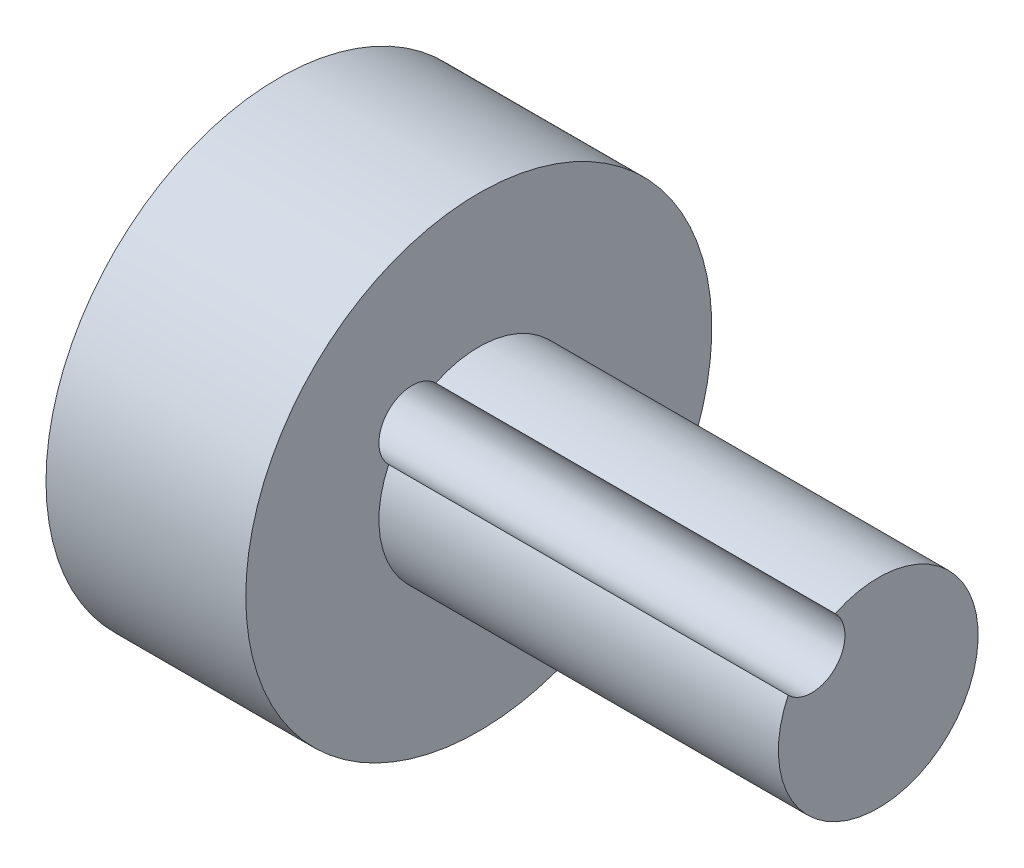
ISO-10303-21;
HEADER;
FILE_DESCRIPTION(('STEP AP214'),'2;1');
FILE_NAME('part.step','',(''),(''),'','','');
FILE_SCHEMA(('AUTOMOTIVE_DESIGN { 1 0 10303 214 1 1 1 1 }'));
ENDSEC;
DATA;
#1=APPLICATION_CONTEXT('core data for automotive mechanical design processes');
#2=APPLICATION_PROTOCOL_DEFINITION('international standard','automotive_design',2000,#1);
#3=PRODUCT_CONTEXT('',#1,'mechanical');
#4=PRODUCT('Part','Part','',(#3));
#5=PRODUCT_RELATED_PRODUCT_CATEGORY('part','',(#4));
#6=PRODUCT_DEFINITION_FORMATION('','',#4);
#7=PRODUCT_DEFINITION_CONTEXT('part definition',#1,'design');
#8=PRODUCT_DEFINITION('design','',#6,#7);
#9=PRODUCT_DEFINITION_SHAPE('','',#8);
#10=(LENGTH_UNIT() NAMED_UNIT(*) SI_UNIT(.MILLI.,.METRE.));
#11=(NAMED_UNIT(*) PLANE_ANGLE_UNIT() SI_UNIT($,.RADIAN.));
#12=(NAMED_UNIT(*) SI_UNIT($,.STERADIAN.) SOLID_ANGLE_UNIT());
#13=UNCERTAINTY_MEASURE_WITH_UNIT(LENGTH_MEASURE(1.E-05),#10,'distance_accuracy_value','');
#14=(GEOMETRIC_REPRESENTATION_CONTEXT(3) GLOBAL_UNCERTAINTY_ASSIGNED_CONTEXT((#13)) GLOBAL_UNIT_ASSIGNED_CONTEXT((#10,
#11,#12)) REPRESENTATION_CONTEXT('',''));
#15=CARTESIAN_POINT('',(0.,0.,0.));
#16=DIRECTION('',(0.,0.,1.));
#17=DIRECTION('',(1.,0.,0.));
#18=AXIS2_PLACEMENT_3D('',#15,#16,#17);
#19=CARTESIAN_POINT('',(0.,0.,0.));
#20=DIRECTION('',(-1.,0.,0.));
#21=DIRECTION('',(0.,0.,1.));
#22=AXIS2_PLACEMENT_3D('',#19,#20,#21);
#23=CYLINDRICAL_SURFACE('',#22,15.);
#24=DIRECTION('',(-1.,0.,0.));
#25=VECTOR('',#24,1.);
#26=CARTESIAN_POINT('',(50.,13.5355339059327,6.46446609406726));
#27=LINE('',#26,#25);
#28=CARTESIAN_POINT('',(100.,13.5355339059327,6.46446609406726));
#29=VERTEX_POINT('',#28);
#30=CARTESIAN_POINT('',(40.,13.5355339059327,6.46446609406726));
#31=VERTEX_POINT('',#30);
#32=EDGE_CURVE('E58',#29,#31,#27,.T.);
#33=ORIENTED_EDGE('',*,*,#32,.F.);
#34=CARTESIAN_POINT('',(100.,0.,0.));
#35=DIRECTION('',(-1.,0.,0.));
#36=DIRECTION('',(0.,0.,1.));
#37=AXIS2_PLACEMENT_3D('',#34,#35,#36);
#38=CIRCLE('',#37,15.);
#39=CARTESIAN_POINT('',(100.,6.46446609406726,13.5355339059327));
#40=VERTEX_POINT('',#39);
#41=EDGE_CURVE('E69',#29,#40,#38,.T.);
#42=ORIENTED_EDGE('',*,*,#41,.T.);
#43=DIRECTION('',(-1.,0.,0.));
#44=VECTOR('',#43,1.);
#45=CARTESIAN_POINT('',(50.,6.46446609406726,13.5355339059327));
#46=LINE('',#45,#44);
#47=CARTESIAN_POINT('',(40.,6.46446609406726,13.5355339059327));
#48=VERTEX_POINT('',#47);
#49=EDGE_CURVE('E53',#48,#40,#46,.F.);
#50=ORIENTED_EDGE('',*,*,#49,.F.);
#51=CARTESIAN_POINT('',(40.,0.,0.));
#52=DIRECTION('',(-1.,0.,0.));
#53=DIRECTION('',(0.,0.,1.));
#54=AXIS2_PLACEMENT_3D('',#51,#52,#53);
#55=CIRCLE('',#54,15.);
#56=EDGE_CURVE('E71',#31,#48,#55,.T.);
#57=ORIENTED_EDGE('',*,*,#56,.F.);
#58=EDGE_LOOP('',(#33,#42,#50,#57));
#59=FACE_BOUND('',#58,.T.);
#60=ADVANCED_FACE('F39',(#59),#23,.T.);
#61=CARTESIAN_POINT('',(0.,0.,0.));
#62=DIRECTION('',(1.,0.,0.));
#63=DIRECTION('',(0.,0.,-1.));
#64=AXIS2_PLACEMENT_3D('',#61,#62,#63);
#65=PLANE('',#64);
#66=CARTESIAN_POINT('',(0.,10.,10.));
#67=DIRECTION('',(1.,0.,0.));
#68=DIRECTION('',(0.,0.,-1.));
#69=AXIS2_PLACEMENT_3D('',#66,#67,#68);
#70=CIRCLE('',#69,5.);
#71=CARTESIAN_POINT('',(0.,10.,5.));
#72=VERTEX_POINT('',#71);
#73=EDGE_CURVE('E141',#72,#72,#70,.T.);
#74=ORIENTED_EDGE('',*,*,#73,.T.);
#75=EDGE_LOOP('',(#74));
#76=FACE_BOUND('',#75,.T.);
#77=CARTESIAN_POINT('',(0.,10.,-10.));
#78=DIRECTION('',(1.,0.,0.));
#79=DIRECTION('',(0.,0.,-1.));
#80=AXIS2_PLACEMENT_3D('',#77,#78,#79);
#81=CIRCLE('',#80,5.);
#82=CARTESIAN_POINT('',(0.,10.,-15.));
#83=VERTEX_POINT('',#82);
#84=EDGE_CURVE('E72',#83,#83,#81,.T.);
#85=ORIENTED_EDGE('',*,*,#84,.T.);
#86=EDGE_LOOP('',(#85));
#87=FACE_BOUND('',#86,.T.);
#88=CARTESIAN_POINT('',(0.,0.,0.));
#89=DIRECTION('',(-1.,0.,0.));
#90=DIRECTION('',(0.,0.,1.));
#91=AXIS2_PLACEMENT_3D('',#88,#89,#90);
#92=CIRCLE('',#91,20.);
#93=CARTESIAN_POINT('',(0.,0.,20.));
#94=VERTEX_POINT('',#93);
#95=EDGE_CURVE('E47',#94,#94,#92,.T.);
#96=ORIENTED_EDGE('',*,*,#95,.T.);
#97=EDGE_LOOP('',(#96));
#98=FACE_BOUND('',#97,.T.);
#99=ADVANCED_FACE('F41',(#76,#87,#98),#65,.F.);
#100=CARTESIAN_POINT('',(0.,0.,0.));
#101=DIRECTION('',(-1.,0.,0.));
#102=DIRECTION('',(0.,0.,1.));
#103=AXIS2_PLACEMENT_3D('',#100,#101,#102);
#104=CYLINDRICAL_SURFACE('',#103,20.);
#105=ORIENTED_EDGE('',*,*,#95,.F.);
#106=EDGE_LOOP('',(#105));
#107=FACE_BOUND('',#106,.T.);
#108=CARTESIAN_POINT('',(10.,0.,0.));
#109=DIRECTION('',(-1.,0.,0.));
#110=DIRECTION('',(0.,0.,1.));
#111=AXIS2_PLACEMENT_3D('',#108,#109,#110);
#112=CIRCLE('',#111,20.);
#113=CARTESIAN_POINT('',(10.,0.,20.));
#114=VERTEX_POINT('',#113);
#115=EDGE_CURVE('E89',#114,#114,#112,.T.);
#116=ORIENTED_EDGE('',*,*,#115,.T.);
#117=EDGE_LOOP('',(#116));
#118=FACE_BOUND('',#117,.T.);
#119=ADVANCED_FACE('F95',(#107,#118),#104,.T.);
#120=CARTESIAN_POINT('',(10.,20.,0.));
#121=DIRECTION('',(1.,0.,0.));
#122=DIRECTION('',(0.,0.,-1.));
#123=AXIS2_PLACEMENT_3D('',#120,#121,#122);
#124=PLANE('',#123);
#125=ORIENTED_EDGE('',*,*,#115,.F.);
#126=EDGE_LOOP('',(#125));
#127=FACE_BOUND('',#126,.T.);
#128=CARTESIAN_POINT('',(10.,0.,0.));
#129=DIRECTION('',(-1.,0.,0.));
#130=DIRECTION('',(0.,0.,1.));
#131=AXIS2_PLACEMENT_3D('',#128,#129,#130);
#132=CIRCLE('',#131,35.);
#133=CARTESIAN_POINT('',(10.,0.,35.));
#134=VERTEX_POINT('',#133);
#135=EDGE_CURVE('E86',#134,#134,#132,.T.);
#136=ORIENTED_EDGE('',*,*,#135,.T.);
#137=EDGE_LOOP('',(#136));
#138=FACE_BOUND('',#137,.T.);
#139=ADVANCED_FACE('F98',(#127,#138),#124,.F.);
#140=CARTESIAN_POINT('',(0.,0.,0.));
#141=DIRECTION('',(-1.,0.,0.));
#142=DIRECTION('',(0.,0.,1.));
#143=AXIS2_PLACEMENT_3D('',#140,#141,#142);
#144=CYLINDRICAL_SURFACE('',#143,35.);
#145=ORIENTED_EDGE('',*,*,#135,.F.);
#146=EDGE_LOOP('',(#145));
#147=FACE_BOUND('',#146,.T.);
#148=CARTESIAN_POINT('',(40.,0.,0.));
#149=DIRECTION('',(-1.,0.,0.));
#150=DIRECTION('',(0.,0.,1.));
#151=AXIS2_PLACEMENT_3D('',#148,#149,#150);
#152=CIRCLE('',#151,35.);
#153=CARTESIAN_POINT('',(40.,0.,35.));
#154=VERTEX_POINT('',#153);
#155=EDGE_CURVE('E78',#154,#154,#152,.T.);
#156=ORIENTED_EDGE('',*,*,#155,.T.);
#157=EDGE_LOOP('',(#156));
#158=FACE_BOUND('',#157,.T.);
#159=ADVANCED_FACE('F103',(#147,#158),#144,.T.);
#160=CARTESIAN_POINT('',(40.,35.,0.));
#161=DIRECTION('',(-1.,0.,0.));
#162=DIRECTION('',(0.,0.,1.));
#163=AXIS2_PLACEMENT_3D('',#160,#161,#162);
#164=PLANE('',#163);
#165=CARTESIAN_POINT('',(40.,10.,10.));
#166=DIRECTION('',(-1.,0.,0.));
#167=DIRECTION('',(0.,0.,1.));
#168=AXIS2_PLACEMENT_3D('',#165,#166,#167);
#169=CIRCLE('',#168,5.);
#170=EDGE_CURVE('E73',#31,#48,#169,.F.);
#171=ORIENTED_EDGE('',*,*,#170,.F.);
#172=ORIENTED_EDGE('',*,*,#56,.T.);
#173=EDGE_LOOP('',(#171,#172));
#174=FACE_BOUND('',#173,.T.);
#175=ORIENTED_EDGE('',*,*,#155,.F.);
#176=EDGE_LOOP('',(#175));
#177=FACE_BOUND('',#176,.T.);
#178=ADVANCED_FACE('F109',(#174,#177),#164,.F.);
#179=CARTESIAN_POINT('',(100.,0.,0.));
#180=DIRECTION('',(-1.,0.,0.));
#181=DIRECTION('',(0.,0.,1.));
#182=AXIS2_PLACEMENT_3D('',#179,#180,#181);
#183=PLANE('',#182);
#184=CARTESIAN_POINT('',(100.,10.,10.));
#185=DIRECTION('',(-1.,0.,0.));
#186=DIRECTION('',(0.,0.,1.));
#187=AXIS2_PLACEMENT_3D('',#184,#185,#186);
#188=CIRCLE('',#187,5.);
#189=EDGE_CURVE('E11',#40,#29,#188,.F.);
#190=ORIENTED_EDGE('',*,*,#189,.F.);
#191=ORIENTED_EDGE('',*,*,#41,.F.);
#192=EDGE_LOOP('',(#190,#191));
#193=FACE_BOUND('',#192,.T.);
#194=ADVANCED_FACE('F75',(#193),#183,.F.);
#195=CARTESIAN_POINT('',(20.,10.,-10.));
#196=DIRECTION('',(-1.,0.,0.));
#197=DIRECTION('',(0.,0.,1.));
#198=AXIS2_PLACEMENT_3D('',#195,#196,#197);
#199=CYLINDRICAL_SURFACE('',#198,5.);
#200=CARTESIAN_POINT('',(20.,10.,-10.));
#201=DIRECTION('',(1.,0.,0.));
#202=DIRECTION('',(0.,0.,-1.));
#203=AXIS2_PLACEMENT_3D('',#200,#201,#202);
#204=CIRCLE('',#203,5.);
#205=CARTESIAN_POINT('',(20.,10.,-15.));
#206=VERTEX_POINT('',#205);
#207=EDGE_CURVE('E76',#206,#206,#204,.T.);
#208=ORIENTED_EDGE('',*,*,#207,.T.);
#209=EDGE_LOOP('',(#208));
#210=FACE_BOUND('',#209,.T.);
#211=ORIENTED_EDGE('',*,*,#84,.F.);
#212=EDGE_LOOP('',(#211));
#213=FACE_BOUND('',#212,.T.);
#214=ADVANCED_FACE('F120',(#210,#213),#199,.F.);
#215=CARTESIAN_POINT('',(20.,10.,-10.));
#216=DIRECTION('',(1.,0.,0.));
#217=DIRECTION('',(0.,0.,-1.));
#218=AXIS2_PLACEMENT_3D('',#215,#216,#217);
#219=PLANE('',#218);
#220=ORIENTED_EDGE('',*,*,#207,.F.);
#221=EDGE_LOOP('',(#220));
#222=FACE_BOUND('',#221,.T.);
#223=ADVANCED_FACE('F131',(#222),#219,.F.);
#224=CARTESIAN_POINT('',(100.,10.,10.));
#225=DIRECTION('',(-1.,0.,0.));
#226=DIRECTION('',(0.,0.,1.));
#227=AXIS2_PLACEMENT_3D('',#224,#225,#226);
#228=CYLINDRICAL_SURFACE('',#227,5.);
#229=ORIENTED_EDGE('',*,*,#73,.F.);
#230=EDGE_LOOP('',(#229));
#231=FACE_BOUND('',#230,.T.);
#232=ORIENTED_EDGE('',*,*,#32,.T.);
#233=ORIENTED_EDGE('',*,*,#170,.T.);
#234=ORIENTED_EDGE('',*,*,#49,.T.);
#235=ORIENTED_EDGE('',*,*,#189,.T.);
#236=EDGE_LOOP('',(#232,#233,#234,#235));
#237=FACE_BOUND('',#236,.T.);
#238=ADVANCED_FACE('F63',(#231,#237),#228,.F.);
#239=CLOSED_SHELL('',(#60,#99,#119,#139,#159,#178,#194,#214,#223,#238));
#240=MANIFOLD_SOLID_BREP('B2',#239);
#241=ADVANCED_BREP_SHAPE_REPRESENTATION('',(#18,#240),#14);
#242=SHAPE_DEFINITION_REPRESENTATION(#9,#241);
ENDSEC;
END-ISO-10303-21;
